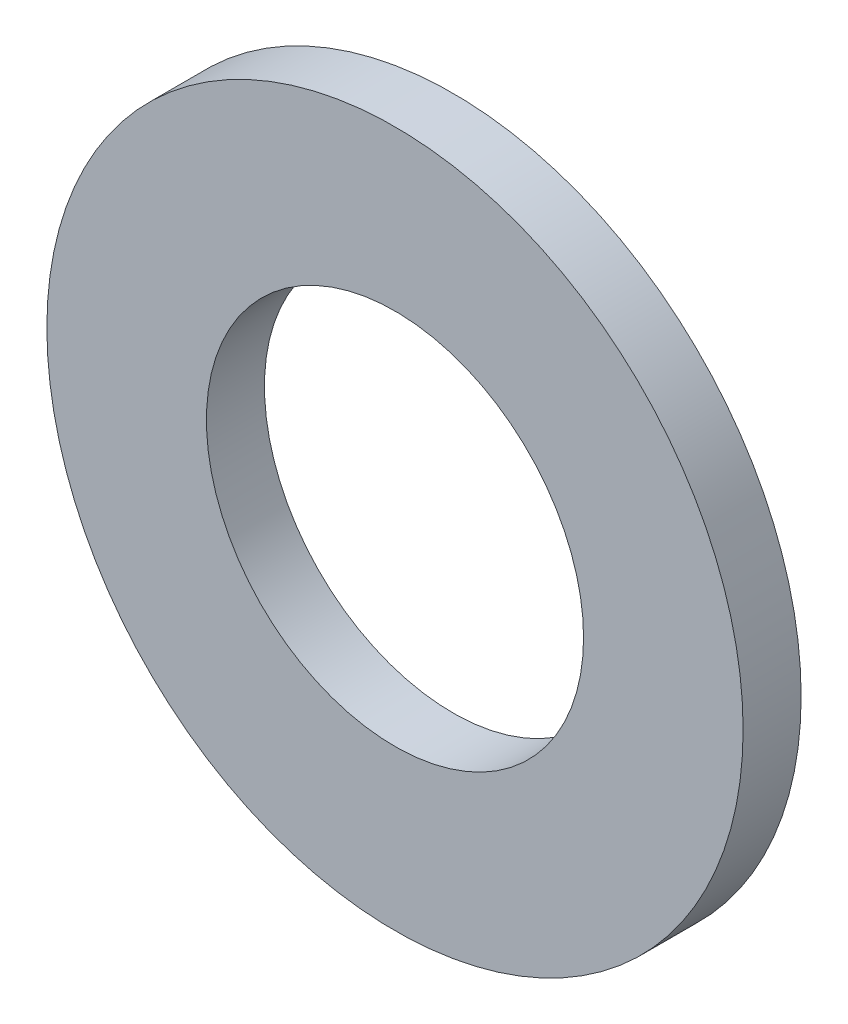
ISO-10303-21;
HEADER;
FILE_DESCRIPTION(('STEP AP214'),'2;1');
FILE_NAME('part.step','',(''),(''),'','','');
FILE_SCHEMA(('AUTOMOTIVE_DESIGN { 1 0 10303 214 1 1 1 1 }'));
ENDSEC;
DATA;
#1=APPLICATION_CONTEXT('core data for automotive mechanical design processes');
#2=APPLICATION_PROTOCOL_DEFINITION('international standard','automotive_design',2000,#1);
#3=PRODUCT_CONTEXT('',#1,'mechanical');
#4=PRODUCT('Part','Part','',(#3));
#5=PRODUCT_RELATED_PRODUCT_CATEGORY('part','',(#4));
#6=PRODUCT_DEFINITION_FORMATION('','',#4);
#7=PRODUCT_DEFINITION_CONTEXT('part definition',#1,'design');
#8=PRODUCT_DEFINITION('design','',#6,#7);
#9=PRODUCT_DEFINITION_SHAPE('','',#8);
#10=(LENGTH_UNIT() NAMED_UNIT(*) SI_UNIT(.MILLI.,.METRE.));
#11=(NAMED_UNIT(*) PLANE_ANGLE_UNIT() SI_UNIT($,.RADIAN.));
#12=(NAMED_UNIT(*) SI_UNIT($,.STERADIAN.) SOLID_ANGLE_UNIT());
#13=UNCERTAINTY_MEASURE_WITH_UNIT(LENGTH_MEASURE(1.E-05),#10,'distance_accuracy_value','');
#14=(GEOMETRIC_REPRESENTATION_CONTEXT(3) GLOBAL_UNCERTAINTY_ASSIGNED_CONTEXT((#13)) GLOBAL_UNIT_ASSIGNED_CONTEXT((#10,
#11,#12)) REPRESENTATION_CONTEXT('',''));
#15=CARTESIAN_POINT('',(0.,0.,0.));
#16=DIRECTION('',(0.,0.,1.));
#17=DIRECTION('',(1.,0.,0.));
#18=AXIS2_PLACEMENT_3D('',#15,#16,#17);
#19=CARTESIAN_POINT('',(0.,0.,1.));
#20=DIRECTION('',(0.,0.,1.));
#21=DIRECTION('',(1.,0.,0.));
#22=AXIS2_PLACEMENT_3D('',#19,#20,#21);
#23=PLANE('',#22);
#24=CARTESIAN_POINT('',(0.,0.,1.));
#25=DIRECTION('',(0.,0.,1.));
#26=DIRECTION('',(1.,0.,0.));
#27=AXIS2_PLACEMENT_3D('',#24,#25,#26);
#28=CIRCLE('',#27,6.);
#29=CARTESIAN_POINT('',(6.,0.,1.));
#30=VERTEX_POINT('',#29);
#31=EDGE_CURVE('E10',#30,#30,#28,.T.);
#32=ORIENTED_EDGE('',*,*,#31,.T.);
#33=EDGE_LOOP('',(#32));
#34=FACE_BOUND('',#33,.T.);
#35=CARTESIAN_POINT('',(0.,0.,1.));
#36=DIRECTION('',(0.,0.,1.));
#37=DIRECTION('',(1.,0.,0.));
#38=AXIS2_PLACEMENT_3D('',#35,#36,#37);
#39=CIRCLE('',#38,3.25);
#40=CARTESIAN_POINT('',(3.25,0.,1.));
#41=VERTEX_POINT('',#40);
#42=EDGE_CURVE('E46',#41,#41,#39,.T.);
#43=ORIENTED_EDGE('',*,*,#42,.F.);
#44=EDGE_LOOP('',(#43));
#45=FACE_BOUND('',#44,.T.);
#46=ADVANCED_FACE('F35',(#34,#45),#23,.T.);
#47=CARTESIAN_POINT('',(0.,0.,0.));
#48=DIRECTION('',(0.,0.,1.));
#49=DIRECTION('',(1.,0.,0.));
#50=AXIS2_PLACEMENT_3D('',#47,#48,#49);
#51=PLANE('',#50);
#52=CARTESIAN_POINT('',(0.,0.,0.));
#53=DIRECTION('',(0.,0.,1.));
#54=DIRECTION('',(1.,0.,0.));
#55=AXIS2_PLACEMENT_3D('',#52,#53,#54);
#56=CIRCLE('',#55,6.);
#57=CARTESIAN_POINT('',(6.,0.,0.));
#58=VERTEX_POINT('',#57);
#59=EDGE_CURVE('E39',#58,#58,#56,.T.);
#60=ORIENTED_EDGE('',*,*,#59,.F.);
#61=EDGE_LOOP('',(#60));
#62=FACE_BOUND('',#61,.T.);
#63=CARTESIAN_POINT('',(0.,0.,0.));
#64=DIRECTION('',(0.,0.,1.));
#65=DIRECTION('',(1.,0.,0.));
#66=AXIS2_PLACEMENT_3D('',#63,#64,#65);
#67=CIRCLE('',#66,3.25);
#68=CARTESIAN_POINT('',(3.25,0.,0.));
#69=VERTEX_POINT('',#68);
#70=EDGE_CURVE('E48',#69,#69,#67,.T.);
#71=ORIENTED_EDGE('',*,*,#70,.T.);
#72=EDGE_LOOP('',(#71));
#73=FACE_BOUND('',#72,.T.);
#74=ADVANCED_FACE('F58',(#62,#73),#51,.F.);
#75=CARTESIAN_POINT('',(0.,0.,1.));
#76=DIRECTION('',(0.,0.,-1.));
#77=DIRECTION('',(-1.,0.,0.));
#78=AXIS2_PLACEMENT_3D('',#75,#76,#77);
#79=CYLINDRICAL_SURFACE('',#78,6.);
#80=ORIENTED_EDGE('',*,*,#31,.F.);
#81=EDGE_LOOP('',(#80));
#82=FACE_BOUND('',#81,.T.);
#83=ORIENTED_EDGE('',*,*,#59,.T.);
#84=EDGE_LOOP('',(#83));
#85=FACE_BOUND('',#84,.T.);
#86=ADVANCED_FACE('F37',(#82,#85),#79,.T.);
#87=CARTESIAN_POINT('',(0.,0.,1.));
#88=DIRECTION('',(0.,0.,-1.));
#89=DIRECTION('',(-1.,0.,0.));
#90=AXIS2_PLACEMENT_3D('',#87,#88,#89);
#91=CYLINDRICAL_SURFACE('',#90,3.25);
#92=ORIENTED_EDGE('',*,*,#42,.T.);
#93=EDGE_LOOP('',(#92));
#94=FACE_BOUND('',#93,.T.);
#95=ORIENTED_EDGE('',*,*,#70,.F.);
#96=EDGE_LOOP('',(#95));
#97=FACE_BOUND('',#96,.T.);
#98=ADVANCED_FACE('F54',(#94,#97),#91,.F.);
#99=CLOSED_SHELL('',(#46,#74,#86,#98));
#100=MANIFOLD_SOLID_BREP('B2',#99);
#101=ADVANCED_BREP_SHAPE_REPRESENTATION('',(#18,#100),#14);
#102=SHAPE_DEFINITION_REPRESENTATION(#9,#101);
ENDSEC;
END-ISO-10303-21;
